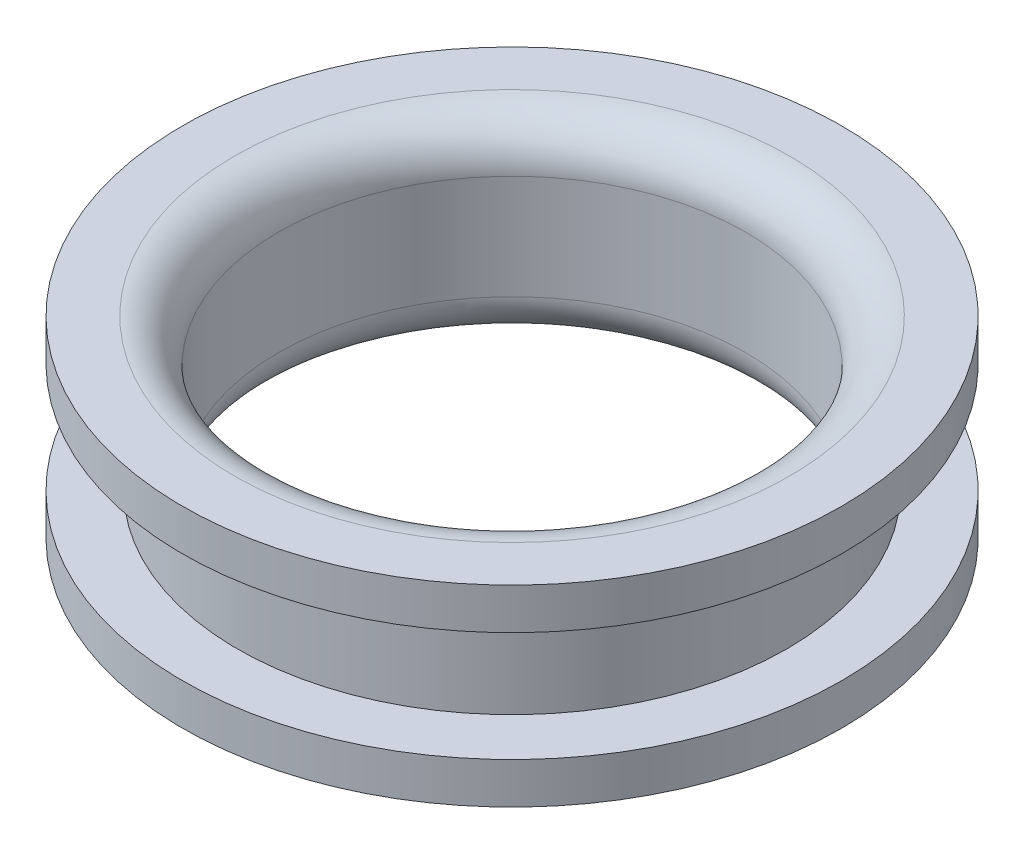
ISO-10303-21;
HEADER;
FILE_DESCRIPTION(('STEP AP214'),'2;1');
FILE_NAME('part.step','',(''),(''),'','','');
FILE_SCHEMA(('AUTOMOTIVE_DESIGN { 1 0 10303 214 1 1 1 1 }'));
ENDSEC;
DATA;
#1=APPLICATION_CONTEXT('core data for automotive mechanical design processes');
#2=APPLICATION_PROTOCOL_DEFINITION('international standard','automotive_design',2000,#1);
#3=PRODUCT_CONTEXT('',#1,'mechanical');
#4=PRODUCT('Part','Part','',(#3));
#5=PRODUCT_RELATED_PRODUCT_CATEGORY('part','',(#4));
#6=PRODUCT_DEFINITION_FORMATION('','',#4);
#7=PRODUCT_DEFINITION_CONTEXT('part definition',#1,'design');
#8=PRODUCT_DEFINITION('design','',#6,#7);
#9=PRODUCT_DEFINITION_SHAPE('','',#8);
#10=(LENGTH_UNIT() NAMED_UNIT(*) SI_UNIT(.MILLI.,.METRE.));
#11=(NAMED_UNIT(*) PLANE_ANGLE_UNIT() SI_UNIT($,.RADIAN.));
#12=(NAMED_UNIT(*) SI_UNIT($,.STERADIAN.) SOLID_ANGLE_UNIT());
#13=UNCERTAINTY_MEASURE_WITH_UNIT(LENGTH_MEASURE(1.E-05),#10,'distance_accuracy_value','');
#14=(GEOMETRIC_REPRESENTATION_CONTEXT(3) GLOBAL_UNCERTAINTY_ASSIGNED_CONTEXT((#13)) GLOBAL_UNIT_ASSIGNED_CONTEXT((#10,
#11,#12)) REPRESENTATION_CONTEXT('',''));
#15=CARTESIAN_POINT('',(0.,0.,0.));
#16=DIRECTION('',(0.,0.,1.));
#17=DIRECTION('',(1.,0.,0.));
#18=AXIS2_PLACEMENT_3D('',#15,#16,#17);
#19=CARTESIAN_POINT('',(3.49696643932152E-12,-1019.44973687258,0.));
#20=DIRECTION('',(0.,-1.,0.));
#21=DIRECTION('',(1.,0.,0.));
#22=AXIS2_PLACEMENT_3D('',#19,#20,#21);
#23=CYLINDRICAL_SURFACE('',#22,42.5);
#24=CARTESIAN_POINT('',(0.,9.49999999999984,0.));
#25=DIRECTION('',(0.,1.,0.));
#26=DIRECTION('',(-1.,0.,0.));
#27=AXIS2_PLACEMENT_3D('',#24,#25,#26);
#28=CIRCLE('',#27,42.5);
#29=CARTESIAN_POINT('',(-42.5,9.4999999999997,0.));
#30=VERTEX_POINT('',#29);
#31=EDGE_CURVE('E40',#30,#30,#28,.T.);
#32=ORIENTED_EDGE('',*,*,#31,.T.);
#33=EDGE_LOOP('',(#32));
#34=FACE_BOUND('',#33,.T.);
#35=CARTESIAN_POINT('',(0.,-9.50000000000029,0.));
#36=DIRECTION('',(0.,-1.,0.));
#37=DIRECTION('',(1.,0.,0.));
#38=AXIS2_PLACEMENT_3D('',#35,#36,#37);
#39=CIRCLE('',#38,42.5);
#40=CARTESIAN_POINT('',(42.5,-9.50000000000014,0.));
#41=VERTEX_POINT('',#40);
#42=EDGE_CURVE('E44',#41,#41,#39,.T.);
#43=ORIENTED_EDGE('',*,*,#42,.T.);
#44=EDGE_LOOP('',(#43));
#45=FACE_BOUND('',#44,.T.);
#46=ADVANCED_FACE('F33',(#34,#45),#23,.F.);
#47=CARTESIAN_POINT('',(42.5,-17.5,0.));
#48=DIRECTION('',(0.,-1.,0.));
#49=DIRECTION('',(1.,0.,0.));
#50=AXIS2_PLACEMENT_3D('',#47,#48,#49);
#51=PLANE('',#50);
#52=CARTESIAN_POINT('',(0.,-17.5000000000002,0.));
#53=DIRECTION('',(0.,-1.,0.));
#54=DIRECTION('',(1.,0.,0.));
#55=AXIS2_PLACEMENT_3D('',#52,#53,#54);
#56=CIRCLE('',#55,50.5);
#57=CARTESIAN_POINT('',(50.5000000000001,-17.5,0.));
#58=VERTEX_POINT('',#57);
#59=EDGE_CURVE('E10',#58,#58,#56,.F.);
#60=ORIENTED_EDGE('',*,*,#59,.T.);
#61=EDGE_LOOP('',(#60));
#62=FACE_BOUND('',#61,.T.);
#63=CARTESIAN_POINT('',(0.,-17.5000000000003,0.));
#64=DIRECTION('',(0.,-1.,0.));
#65=DIRECTION('',(1.,0.,0.));
#66=AXIS2_PLACEMENT_3D('',#63,#64,#65);
#67=CIRCLE('',#66,59.9999999999999);
#68=CARTESIAN_POINT('',(60.,-17.5000000000001,0.));
#69=VERTEX_POINT('',#68);
#70=EDGE_CURVE('E53',#69,#69,#67,.T.);
#71=ORIENTED_EDGE('',*,*,#70,.T.);
#72=EDGE_LOOP('',(#71));
#73=FACE_BOUND('',#72,.T.);
#74=ADVANCED_FACE('F88',(#62,#73),#51,.T.);
#75=CARTESIAN_POINT('',(3.49696643932152E-12,-1019.44973687258,0.));
#76=DIRECTION('',(0.,-1.,0.));
#77=DIRECTION('',(1.,0.,0.));
#78=AXIS2_PLACEMENT_3D('',#75,#76,#77);
#79=CYLINDRICAL_SURFACE('',#78,60.);
#80=CARTESIAN_POINT('',(0.,-10.0000000000002,0.));
#81=DIRECTION('',(0.,-1.,0.));
#82=DIRECTION('',(1.,0.,0.));
#83=AXIS2_PLACEMENT_3D('',#80,#81,#82);
#84=CIRCLE('',#83,60.);
#85=CARTESIAN_POINT('',(60.,-10.,0.));
#86=VERTEX_POINT('',#85);
#87=EDGE_CURVE('E56',#86,#86,#84,.T.);
#88=ORIENTED_EDGE('',*,*,#87,.T.);
#89=EDGE_LOOP('',(#88));
#90=FACE_BOUND('',#89,.T.);
#91=ORIENTED_EDGE('',*,*,#70,.F.);
#92=EDGE_LOOP('',(#91));
#93=FACE_BOUND('',#92,.T.);
#94=ADVANCED_FACE('F93',(#90,#93),#79,.T.);
#95=CARTESIAN_POINT('',(60.,-9.99999999999998,0.));
#96=DIRECTION('',(0.,1.,0.));
#97=DIRECTION('',(-1.,0.,0.));
#98=AXIS2_PLACEMENT_3D('',#95,#96,#97);
#99=PLANE('',#98);
#100=CARTESIAN_POINT('',(0.,-10.0000000000002,0.));
#101=DIRECTION('',(0.,-1.,0.));
#102=DIRECTION('',(1.,0.,0.));
#103=AXIS2_PLACEMENT_3D('',#100,#101,#102);
#104=CIRCLE('',#103,50.);
#105=CARTESIAN_POINT('',(50.,-10.0000000000001,0.));
#106=VERTEX_POINT('',#105);
#107=EDGE_CURVE('E59',#106,#106,#104,.T.);
#108=ORIENTED_EDGE('',*,*,#107,.T.);
#109=EDGE_LOOP('',(#108));
#110=FACE_BOUND('',#109,.T.);
#111=ORIENTED_EDGE('',*,*,#87,.F.);
#112=EDGE_LOOP('',(#111));
#113=FACE_BOUND('',#112,.T.);
#114=ADVANCED_FACE('F99',(#110,#113),#99,.T.);
#115=CARTESIAN_POINT('',(3.49696643932152E-12,-1019.44973687258,0.));
#116=DIRECTION('',(0.,-1.,0.));
#117=DIRECTION('',(1.,0.,0.));
#118=AXIS2_PLACEMENT_3D('',#115,#116,#117);
#119=CYLINDRICAL_SURFACE('',#118,50.);
#120=CARTESIAN_POINT('',(0.,9.99999999999979,0.));
#121=DIRECTION('',(0.,-1.,0.));
#122=DIRECTION('',(1.,0.,0.));
#123=AXIS2_PLACEMENT_3D('',#120,#121,#122);
#124=CIRCLE('',#123,50.);
#125=CARTESIAN_POINT('',(50.,9.99999999999996,0.));
#126=VERTEX_POINT('',#125);
#127=EDGE_CURVE('E62',#126,#126,#124,.T.);
#128=ORIENTED_EDGE('',*,*,#127,.T.);
#129=EDGE_LOOP('',(#128));
#130=FACE_BOUND('',#129,.T.);
#131=ORIENTED_EDGE('',*,*,#107,.F.);
#132=EDGE_LOOP('',(#131));
#133=FACE_BOUND('',#132,.T.);
#134=ADVANCED_FACE('F103',(#130,#133),#119,.T.);
#135=CARTESIAN_POINT('',(50.,9.99999999999998,0.));
#136=DIRECTION('',(0.,-1.,0.));
#137=DIRECTION('',(1.,0.,0.));
#138=AXIS2_PLACEMENT_3D('',#135,#136,#137);
#139=PLANE('',#138);
#140=CARTESIAN_POINT('',(0.,9.99999999999979,0.));
#141=DIRECTION('',(0.,-1.,0.));
#142=DIRECTION('',(1.,0.,0.));
#143=AXIS2_PLACEMENT_3D('',#140,#141,#142);
#144=CIRCLE('',#143,60.);
#145=CARTESIAN_POINT('',(60.,9.99999999999999,0.));
#146=VERTEX_POINT('',#145);
#147=EDGE_CURVE('E65',#146,#146,#144,.T.);
#148=ORIENTED_EDGE('',*,*,#147,.T.);
#149=EDGE_LOOP('',(#148));
#150=FACE_BOUND('',#149,.T.);
#151=ORIENTED_EDGE('',*,*,#127,.F.);
#152=EDGE_LOOP('',(#151));
#153=FACE_BOUND('',#152,.T.);
#154=ADVANCED_FACE('F85',(#150,#153),#139,.T.);
#155=CARTESIAN_POINT('',(3.49696643932152E-12,-1019.44973687258,0.));
#156=DIRECTION('',(0.,-1.,0.));
#157=DIRECTION('',(1.,0.,0.));
#158=AXIS2_PLACEMENT_3D('',#155,#156,#157);
#159=CYLINDRICAL_SURFACE('',#158,60.);
#160=CARTESIAN_POINT('',(0.,17.4999999999999,0.));
#161=DIRECTION('',(0.,-1.,0.));
#162=DIRECTION('',(1.,0.,0.));
#163=AXIS2_PLACEMENT_3D('',#160,#161,#162);
#164=CIRCLE('',#163,60.0000000000001);
#165=CARTESIAN_POINT('',(60.,17.5000000000001,0.));
#166=VERTEX_POINT('',#165);
#167=EDGE_CURVE('E68',#166,#166,#164,.T.);
#168=ORIENTED_EDGE('',*,*,#167,.T.);
#169=EDGE_LOOP('',(#168));
#170=FACE_BOUND('',#169,.T.);
#171=ORIENTED_EDGE('',*,*,#147,.F.);
#172=EDGE_LOOP('',(#171));
#173=FACE_BOUND('',#172,.T.);
#174=ADVANCED_FACE('F72',(#170,#173),#159,.T.);
#175=CARTESIAN_POINT('',(60.,17.5,0.));
#176=DIRECTION('',(0.,1.,0.));
#177=DIRECTION('',(-1.,0.,0.));
#178=AXIS2_PLACEMENT_3D('',#175,#176,#177);
#179=PLANE('',#178);
#180=CARTESIAN_POINT('',(0.,17.4999999999998,0.));
#181=DIRECTION('',(0.,1.,0.));
#182=DIRECTION('',(-1.,0.,0.));
#183=AXIS2_PLACEMENT_3D('',#180,#181,#182);
#184=CIRCLE('',#183,50.5);
#185=CARTESIAN_POINT('',(-50.5000000000001,17.4999999999997,0.));
#186=VERTEX_POINT('',#185);
#187=EDGE_CURVE('E48',#186,#186,#184,.F.);
#188=ORIENTED_EDGE('',*,*,#187,.T.);
#189=EDGE_LOOP('',(#188));
#190=FACE_BOUND('',#189,.T.);
#191=ORIENTED_EDGE('',*,*,#167,.F.);
#192=EDGE_LOOP('',(#191));
#193=FACE_BOUND('',#192,.T.);
#194=ADVANCED_FACE('F75',(#190,#193),#179,.T.);
#195=CARTESIAN_POINT('',(0.,9.49999999999984,0.));
#196=DIRECTION('',(0.,1.,0.));
#197=DIRECTION('',(-1.,0.,0.));
#198=AXIS2_PLACEMENT_3D('',#195,#196,#197);
#199=TOROIDAL_SURFACE('',#198,50.5,8.);
#200=ORIENTED_EDGE('',*,*,#31,.F.);
#201=EDGE_LOOP('',(#200));
#202=FACE_BOUND('',#201,.T.);
#203=ORIENTED_EDGE('',*,*,#187,.F.);
#204=EDGE_LOOP('',(#203));
#205=FACE_BOUND('',#204,.T.);
#206=ADVANCED_FACE('F77',(#202,#205),#199,.T.);
#207=CARTESIAN_POINT('',(0.,-9.50000000000029,0.));
#208=DIRECTION('',(0.,-1.,0.));
#209=DIRECTION('',(1.,0.,0.));
#210=AXIS2_PLACEMENT_3D('',#207,#208,#209);
#211=TOROIDAL_SURFACE('',#210,50.5,8.);
#212=ORIENTED_EDGE('',*,*,#59,.F.);
#213=EDGE_LOOP('',(#212));
#214=FACE_BOUND('',#213,.T.);
#215=ORIENTED_EDGE('',*,*,#42,.F.);
#216=EDGE_LOOP('',(#215));
#217=FACE_BOUND('',#216,.T.);
#218=ADVANCED_FACE('F35',(#214,#217),#211,.T.);
#219=CLOSED_SHELL('',(#46,#74,#94,#114,#134,#154,#174,#194,#206,#218));
#220=MANIFOLD_SOLID_BREP('B2',#219);
#221=ADVANCED_BREP_SHAPE_REPRESENTATION('',(#18,#220),#14);
#222=SHAPE_DEFINITION_REPRESENTATION(#9,#221);
ENDSEC;
END-ISO-10303-21;
